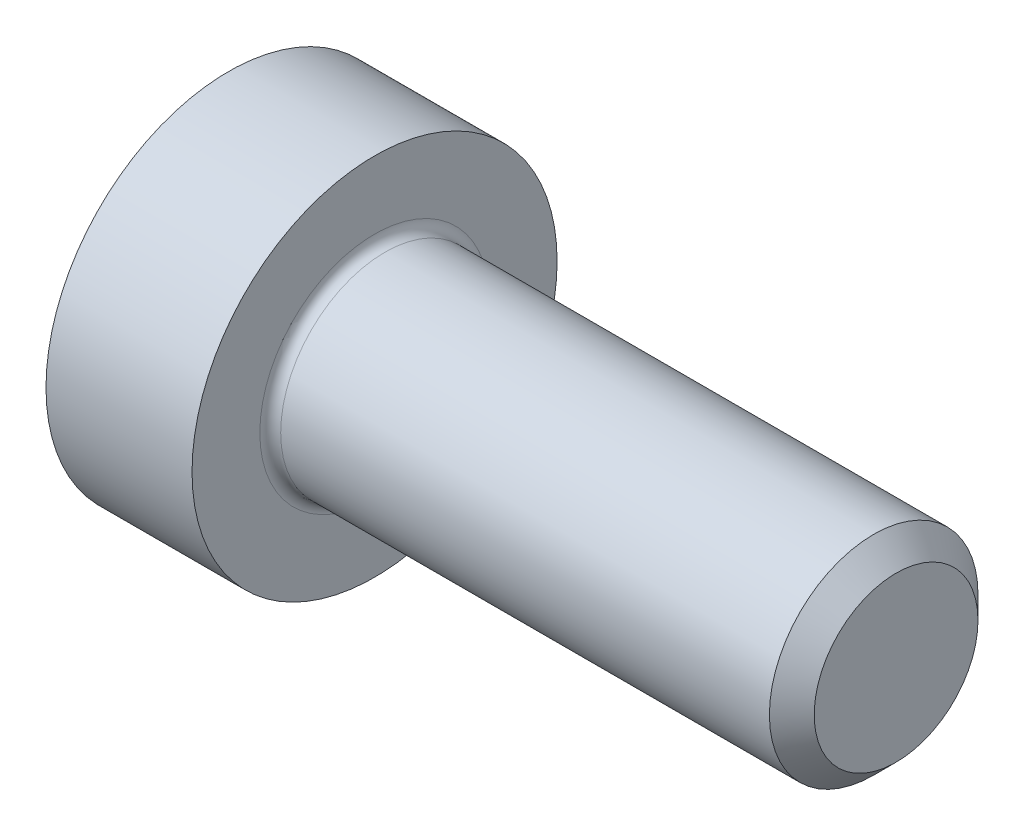
ISO-10303-21;
HEADER;
FILE_DESCRIPTION(('STEP AP214'),'2;1');
FILE_NAME('part.step','',(''),(''),'','','');
FILE_SCHEMA(('AUTOMOTIVE_DESIGN { 1 0 10303 214 1 1 1 1 }'));
ENDSEC;
DATA;
#1=APPLICATION_CONTEXT('core data for automotive mechanical design processes');
#2=APPLICATION_PROTOCOL_DEFINITION('international standard','automotive_design',2000,#1);
#3=PRODUCT_CONTEXT('',#1,'mechanical');
#4=PRODUCT('Part','Part','',(#3));
#5=PRODUCT_RELATED_PRODUCT_CATEGORY('part','',(#4));
#6=PRODUCT_DEFINITION_FORMATION('','',#4);
#7=PRODUCT_DEFINITION_CONTEXT('part definition',#1,'design');
#8=PRODUCT_DEFINITION('design','',#6,#7);
#9=PRODUCT_DEFINITION_SHAPE('','',#8);
#10=(LENGTH_UNIT() NAMED_UNIT(*) SI_UNIT(.MILLI.,.METRE.));
#11=(NAMED_UNIT(*) PLANE_ANGLE_UNIT() SI_UNIT($,.RADIAN.));
#12=(NAMED_UNIT(*) SI_UNIT($,.STERADIAN.) SOLID_ANGLE_UNIT());
#13=UNCERTAINTY_MEASURE_WITH_UNIT(LENGTH_MEASURE(1.E-05),#10,'distance_accuracy_value','');
#14=(GEOMETRIC_REPRESENTATION_CONTEXT(3) GLOBAL_UNCERTAINTY_ASSIGNED_CONTEXT((#13)) GLOBAL_UNIT_ASSIGNED_CONTEXT((#10,
#11,#12)) REPRESENTATION_CONTEXT('',''));
#15=CARTESIAN_POINT('',(0.,0.,0.));
#16=DIRECTION('',(0.,0.,1.));
#17=DIRECTION('',(1.,0.,0.));
#18=AXIS2_PLACEMENT_3D('',#15,#16,#17);
#19=CARTESIAN_POINT('',(-2.8,0.,0.));
#20=DIRECTION('',(1.,0.,0.));
#21=DIRECTION('',(0.,0.,-1.));
#22=AXIS2_PLACEMENT_3D('',#19,#20,#21);
#23=PLANE('',#22);
#24=CARTESIAN_POINT('',(-2.8,0.,0.));
#25=DIRECTION('',(1.,0.,0.));
#26=DIRECTION('',(0.,0.,-1.));
#27=AXIS2_PLACEMENT_3D('',#24,#25,#26);
#28=CIRCLE('',#27,3.5);
#29=CARTESIAN_POINT('',(-2.8,0.,-3.5));
#30=VERTEX_POINT('',#29);
#31=EDGE_CURVE('E139',#30,#30,#28,.T.);
#32=ORIENTED_EDGE('',*,*,#31,.F.);
#33=EDGE_LOOP('',(#32));
#34=FACE_BOUND('',#33,.T.);
#35=DIRECTION('',(0.,0.50000000000002,-0.866025403784427));
#36=VECTOR('',#35,1.);
#37=CARTESIAN_POINT('',(-2.8,-1.4433756729741,0.));
#38=LINE('',#37,#36);
#39=CARTESIAN_POINT('',(-2.8,-1.4433756729741,0.));
#40=VERTEX_POINT('',#39);
#41=CARTESIAN_POINT('',(-2.8,-0.72168783648703,-1.25));
#42=VERTEX_POINT('',#41);
#43=EDGE_CURVE('E122',#40,#42,#38,.T.);
#44=ORIENTED_EDGE('',*,*,#43,.T.);
#45=DIRECTION('',(0.,1.,0.));
#46=VECTOR('',#45,1.);
#47=CARTESIAN_POINT('',(-2.8,-0.72168783648703,-1.25));
#48=LINE('',#47,#46);
#49=CARTESIAN_POINT('',(-2.8,0.72168783648703,-1.25));
#50=VERTEX_POINT('',#49);
#51=EDGE_CURVE('E109',#42,#50,#48,.T.);
#52=ORIENTED_EDGE('',*,*,#51,.T.);
#53=DIRECTION('',(0.,0.50000000000002,0.866025403784427));
#54=VECTOR('',#53,1.);
#55=CARTESIAN_POINT('',(-2.8,0.72168783648703,-1.25));
#56=LINE('',#55,#54);
#57=CARTESIAN_POINT('',(-2.8,1.4433756729741,0.));
#58=VERTEX_POINT('',#57);
#59=EDGE_CURVE('E121',#50,#58,#56,.T.);
#60=ORIENTED_EDGE('',*,*,#59,.T.);
#61=DIRECTION('',(0.,-0.50000000000002,0.866025403784427));
#62=VECTOR('',#61,1.);
#63=CARTESIAN_POINT('',(-2.8,1.4433756729741,0.));
#64=LINE('',#63,#62);
#65=CARTESIAN_POINT('',(-2.8,0.72168783648703,1.25));
#66=VERTEX_POINT('',#65);
#67=EDGE_CURVE('E152',#58,#66,#64,.T.);
#68=ORIENTED_EDGE('',*,*,#67,.T.);
#69=DIRECTION('',(0.,-1.,0.));
#70=VECTOR('',#69,1.);
#71=CARTESIAN_POINT('',(-2.8,0.72168783648703,1.25));
#72=LINE('',#71,#70);
#73=CARTESIAN_POINT('',(-2.8,-0.72168783648703,1.25));
#74=VERTEX_POINT('',#73);
#75=EDGE_CURVE('E158',#66,#74,#72,.T.);
#76=ORIENTED_EDGE('',*,*,#75,.T.);
#77=DIRECTION('',(0.,-0.50000000000002,-0.866025403784427));
#78=VECTOR('',#77,1.);
#79=CARTESIAN_POINT('',(-2.8,-0.72168783648703,1.25));
#80=LINE('',#79,#78);
#81=EDGE_CURVE('E137',#74,#40,#80,.T.);
#82=ORIENTED_EDGE('',*,*,#81,.T.);
#83=EDGE_LOOP('',(#44,#52,#60,#68,#76,#82));
#84=FACE_BOUND('',#83,.T.);
#85=ADVANCED_FACE('F17',(#34,#84),#23,.F.);
#86=CARTESIAN_POINT('',(10.,0.,0.));
#87=DIRECTION('',(1.,0.,0.));
#88=DIRECTION('',(0.,0.,-1.));
#89=AXIS2_PLACEMENT_3D('',#86,#87,#88);
#90=CYLINDRICAL_SURFACE('',#89,3.5);
#91=CARTESIAN_POINT('',(0.,0.,0.));
#92=DIRECTION('',(1.,0.,0.));
#93=DIRECTION('',(0.,0.,-1.));
#94=AXIS2_PLACEMENT_3D('',#91,#92,#93);
#95=CIRCLE('',#94,3.5);
#96=CARTESIAN_POINT('',(0.,0.,-3.5));
#97=VERTEX_POINT('',#96);
#98=EDGE_CURVE('E167',#97,#97,#95,.T.);
#99=ORIENTED_EDGE('',*,*,#98,.F.);
#100=EDGE_LOOP('',(#99));
#101=FACE_BOUND('',#100,.T.);
#102=ORIENTED_EDGE('',*,*,#31,.T.);
#103=EDGE_LOOP('',(#102));
#104=FACE_BOUND('',#103,.T.);
#105=ADVANCED_FACE('F336',(#101,#104),#90,.T.);
#106=CARTESIAN_POINT('',(-0.5,-1.4433756729741,0.));
#107=DIRECTION('',(0.,0.866025403784427,0.50000000000002));
#108=DIRECTION('',(0.,-0.50000000000002,0.866025403784427));
#109=AXIS2_PLACEMENT_3D('',#106,#107,#108);
#110=PLANE('',#109);
#111=ORIENTED_EDGE('',*,*,#43,.F.);
#112=DIRECTION('',(-1.,0.,0.));
#113=VECTOR('',#112,1.);
#114=CARTESIAN_POINT('',(-0.5,-1.4433756729741,0.));
#115=LINE('',#114,#113);
#116=CARTESIAN_POINT('',(-0.5,-1.4433756729741,0.));
#117=VERTEX_POINT('',#116);
#118=EDGE_CURVE('E173',#117,#40,#115,.T.);
#119=ORIENTED_EDGE('',*,*,#118,.F.);
#120=DIRECTION('',(0.,0.50000000000002,-0.866025403784427));
#121=VECTOR('',#120,1.);
#122=CARTESIAN_POINT('',(-0.5,-1.4433756729741,0.));
#123=LINE('',#122,#121);
#124=CARTESIAN_POINT('',(-0.5,-1.08253175473053,-0.625000000000024));
#125=VERTEX_POINT('',#124);
#126=EDGE_CURVE('E176',#117,#125,#123,.T.);
#127=ORIENTED_EDGE('',*,*,#126,.T.);
#128=DIRECTION('',(0.,0.50000000000002,-0.866025403784427));
#129=VECTOR('',#128,1.);
#130=CARTESIAN_POINT('',(-0.5,-1.08253175473055,-0.625000000000031));
#131=LINE('',#130,#129);
#132=CARTESIAN_POINT('',(-0.5,-0.72168783648703,-1.25));
#133=VERTEX_POINT('',#132);
#134=EDGE_CURVE('E131',#125,#133,#131,.T.);
#135=ORIENTED_EDGE('',*,*,#134,.T.);
#136=DIRECTION('',(-1.,0.,0.));
#137=VECTOR('',#136,1.);
#138=CARTESIAN_POINT('',(-0.5,-0.72168783648703,-1.25));
#139=LINE('',#138,#137);
#140=EDGE_CURVE('E113',#133,#42,#139,.T.);
#141=ORIENTED_EDGE('',*,*,#140,.T.);
#142=EDGE_LOOP('',(#111,#119,#127,#135,#141));
#143=FACE_BOUND('',#142,.T.);
#144=ADVANCED_FACE('F127',(#143),#110,.T.);
#145=CARTESIAN_POINT('',(-0.5,-0.72168783648703,-1.25));
#146=DIRECTION('',(0.,0.,1.));
#147=DIRECTION('',(1.,0.,0.));
#148=AXIS2_PLACEMENT_3D('',#145,#146,#147);
#149=PLANE('',#148);
#150=ORIENTED_EDGE('',*,*,#51,.F.);
#151=ORIENTED_EDGE('',*,*,#140,.F.);
#152=DIRECTION('',(0.,1.,0.));
#153=VECTOR('',#152,1.);
#154=CARTESIAN_POINT('',(-0.5,-0.72168783648703,-1.25));
#155=LINE('',#154,#153);
#156=CARTESIAN_POINT('',(-0.5,0.,-1.25));
#157=VERTEX_POINT('',#156);
#158=EDGE_CURVE('E133',#133,#157,#155,.T.);
#159=ORIENTED_EDGE('',*,*,#158,.T.);
#160=DIRECTION('',(0.,1.,0.));
#161=VECTOR('',#160,1.);
#162=CARTESIAN_POINT('',(-0.5,0.,-1.25));
#163=LINE('',#162,#161);
#164=CARTESIAN_POINT('',(-0.5,0.72168783648703,-1.25));
#165=VERTEX_POINT('',#164);
#166=EDGE_CURVE('E191',#157,#165,#163,.T.);
#167=ORIENTED_EDGE('',*,*,#166,.T.);
#168=DIRECTION('',(-1.,0.,0.));
#169=VECTOR('',#168,1.);
#170=CARTESIAN_POINT('',(-0.5,0.72168783648703,-1.25));
#171=LINE('',#170,#169);
#172=EDGE_CURVE('E116',#165,#50,#171,.T.);
#173=ORIENTED_EDGE('',*,*,#172,.T.);
#174=EDGE_LOOP('',(#150,#151,#159,#167,#173));
#175=FACE_BOUND('',#174,.T.);
#176=ADVANCED_FACE('F111',(#175),#149,.T.);
#177=CARTESIAN_POINT('',(-0.5,0.72168783648703,-1.25));
#178=DIRECTION('',(0.,-0.866025403784427,0.50000000000002));
#179=DIRECTION('',(0.,-0.50000000000002,-0.866025403784427));
#180=AXIS2_PLACEMENT_3D('',#177,#178,#179);
#181=PLANE('',#180);
#182=ORIENTED_EDGE('',*,*,#59,.F.);
#183=ORIENTED_EDGE('',*,*,#172,.F.);
#184=DIRECTION('',(0.,0.50000000000002,0.866025403784427));
#185=VECTOR('',#184,1.);
#186=CARTESIAN_POINT('',(-0.5,0.72168783648703,-1.25));
#187=LINE('',#186,#185);
#188=CARTESIAN_POINT('',(-0.5,1.08253175473055,-0.625000000000032));
#189=VERTEX_POINT('',#188);
#190=EDGE_CURVE('E200',#165,#189,#187,.T.);
#191=ORIENTED_EDGE('',*,*,#190,.T.);
#192=DIRECTION('',(0.,0.50000000000002,0.866025403784427));
#193=VECTOR('',#192,1.);
#194=CARTESIAN_POINT('',(-0.5,1.08253175473055,-0.625000000000032));
#195=LINE('',#194,#193);
#196=CARTESIAN_POINT('',(-0.5,1.4433756729741,0.));
#197=VERTEX_POINT('',#196);
#198=EDGE_CURVE('E206',#189,#197,#195,.T.);
#199=ORIENTED_EDGE('',*,*,#198,.T.);
#200=DIRECTION('',(-1.,0.,0.));
#201=VECTOR('',#200,1.);
#202=CARTESIAN_POINT('',(-0.5,1.4433756729741,0.));
#203=LINE('',#202,#201);
#204=EDGE_CURVE('E212',#197,#58,#203,.T.);
#205=ORIENTED_EDGE('',*,*,#204,.T.);
#206=EDGE_LOOP('',(#182,#183,#191,#199,#205));
#207=FACE_BOUND('',#206,.T.);
#208=ADVANCED_FACE('F351',(#207),#181,.T.);
#209=CARTESIAN_POINT('',(-0.5,1.4433756729741,0.));
#210=DIRECTION('',(0.,-0.866025403784427,-0.50000000000002));
#211=DIRECTION('',(0.,0.50000000000002,-0.866025403784427));
#212=AXIS2_PLACEMENT_3D('',#209,#210,#211);
#213=PLANE('',#212);
#214=ORIENTED_EDGE('',*,*,#67,.F.);
#215=ORIENTED_EDGE('',*,*,#204,.F.);
#216=DIRECTION('',(0.,-0.50000000000002,0.866025403784427));
#217=VECTOR('',#216,1.);
#218=CARTESIAN_POINT('',(-0.5,1.4433756729741,0.));
#219=LINE('',#218,#217);
#220=CARTESIAN_POINT('',(-0.5,1.08253175473055,0.625000000000032));
#221=VERTEX_POINT('',#220);
#222=EDGE_CURVE('E218',#197,#221,#219,.T.);
#223=ORIENTED_EDGE('',*,*,#222,.T.);
#224=DIRECTION('',(0.,-0.50000000000002,0.866025403784427));
#225=VECTOR('',#224,1.);
#226=CARTESIAN_POINT('',(-0.5,1.08253175473055,0.625000000000032));
#227=LINE('',#226,#225);
#228=CARTESIAN_POINT('',(-0.5,0.72168783648703,1.25));
#229=VERTEX_POINT('',#228);
#230=EDGE_CURVE('E224',#221,#229,#227,.T.);
#231=ORIENTED_EDGE('',*,*,#230,.T.);
#232=DIRECTION('',(-1.,0.,0.));
#233=VECTOR('',#232,1.);
#234=CARTESIAN_POINT('',(-0.5,0.72168783648703,1.25));
#235=LINE('',#234,#233);
#236=EDGE_CURVE('E230',#229,#66,#235,.T.);
#237=ORIENTED_EDGE('',*,*,#236,.T.);
#238=EDGE_LOOP('',(#214,#215,#223,#231,#237));
#239=FACE_BOUND('',#238,.T.);
#240=ADVANCED_FACE('F354',(#239),#213,.T.);
#241=CARTESIAN_POINT('',(-0.5,0.72168783648703,1.25));
#242=DIRECTION('',(0.,0.,-1.));
#243=DIRECTION('',(-1.,0.,0.));
#244=AXIS2_PLACEMENT_3D('',#241,#242,#243);
#245=PLANE('',#244);
#246=ORIENTED_EDGE('',*,*,#75,.F.);
#247=ORIENTED_EDGE('',*,*,#236,.F.);
#248=DIRECTION('',(0.,-1.,0.));
#249=VECTOR('',#248,1.);
#250=CARTESIAN_POINT('',(-0.5,0.72168783648703,1.25));
#251=LINE('',#250,#249);
#252=CARTESIAN_POINT('',(-0.5,0.,1.25));
#253=VERTEX_POINT('',#252);
#254=EDGE_CURVE('E236',#229,#253,#251,.T.);
#255=ORIENTED_EDGE('',*,*,#254,.T.);
#256=DIRECTION('',(0.,-1.,0.));
#257=VECTOR('',#256,1.);
#258=CARTESIAN_POINT('',(-0.5,0.,1.25));
#259=LINE('',#258,#257);
#260=CARTESIAN_POINT('',(-0.5,-0.72168783648703,1.25));
#261=VERTEX_POINT('',#260);
#262=EDGE_CURVE('E242',#253,#261,#259,.T.);
#263=ORIENTED_EDGE('',*,*,#262,.T.);
#264=DIRECTION('',(-1.,0.,0.));
#265=VECTOR('',#264,1.);
#266=CARTESIAN_POINT('',(-0.5,-0.72168783648703,1.25));
#267=LINE('',#266,#265);
#268=EDGE_CURVE('E248',#261,#74,#267,.T.);
#269=ORIENTED_EDGE('',*,*,#268,.T.);
#270=EDGE_LOOP('',(#246,#247,#255,#263,#269));
#271=FACE_BOUND('',#270,.T.);
#272=ADVANCED_FACE('F358',(#271),#245,.T.);
#273=CARTESIAN_POINT('',(-0.5,-0.72168783648703,1.25));
#274=DIRECTION('',(0.,0.866025403784427,-0.50000000000002));
#275=DIRECTION('',(0.,0.50000000000002,0.866025403784427));
#276=AXIS2_PLACEMENT_3D('',#273,#274,#275);
#277=PLANE('',#276);
#278=ORIENTED_EDGE('',*,*,#81,.F.);
#279=ORIENTED_EDGE('',*,*,#268,.F.);
#280=DIRECTION('',(0.,-0.50000000000002,-0.866025403784427));
#281=VECTOR('',#280,1.);
#282=CARTESIAN_POINT('',(-0.5,-0.72168783648703,1.25));
#283=LINE('',#282,#281);
#284=CARTESIAN_POINT('',(-0.5,-1.08253175473055,0.625000000000032));
#285=VERTEX_POINT('',#284);
#286=EDGE_CURVE('E254',#261,#285,#283,.T.);
#287=ORIENTED_EDGE('',*,*,#286,.T.);
#288=DIRECTION('',(0.,-0.50000000000002,-0.866025403784427));
#289=VECTOR('',#288,1.);
#290=CARTESIAN_POINT('',(-0.5,-1.08253175473055,0.625000000000032));
#291=LINE('',#290,#289);
#292=EDGE_CURVE('E260',#285,#117,#291,.T.);
#293=ORIENTED_EDGE('',*,*,#292,.T.);
#294=ORIENTED_EDGE('',*,*,#118,.T.);
#295=EDGE_LOOP('',(#278,#279,#287,#293,#294));
#296=FACE_BOUND('',#295,.T.);
#297=ADVANCED_FACE('F332',(#296),#277,.T.);
#298=CARTESIAN_POINT('',(0.,3.5,0.));
#299=DIRECTION('',(-1.,0.,0.));
#300=DIRECTION('',(0.,0.,1.));
#301=AXIS2_PLACEMENT_3D('',#298,#299,#300);
#302=PLANE('',#301);
#303=CARTESIAN_POINT('',(0.,0.,0.));
#304=DIRECTION('',(1.,0.,0.));
#305=DIRECTION('',(0.,0.,-1.));
#306=AXIS2_PLACEMENT_3D('',#303,#304,#305);
#307=CIRCLE('',#306,2.2);
#308=CARTESIAN_POINT('',(0.,0.,-2.2));
#309=VERTEX_POINT('',#308);
#310=EDGE_CURVE('E266',#309,#309,#307,.T.);
#311=ORIENTED_EDGE('',*,*,#310,.F.);
#312=EDGE_LOOP('',(#311));
#313=FACE_BOUND('',#312,.T.);
#314=ORIENTED_EDGE('',*,*,#98,.T.);
#315=EDGE_LOOP('',(#314));
#316=FACE_BOUND('',#315,.T.);
#317=ADVANCED_FACE('F328',(#313,#316),#302,.F.);
#318=CARTESIAN_POINT('',(-0.5,0.,0.));
#319=DIRECTION('',(1.,0.,0.));
#320=DIRECTION('',(0.,0.,-1.));
#321=AXIS2_PLACEMENT_3D('',#318,#319,#320);
#322=PLANE('',#321);
#323=CARTESIAN_POINT('',(-0.5,0.,0.));
#324=DIRECTION('',(1.,0.,0.));
#325=DIRECTION('',(0.,-0.866025403784427,0.50000000000002));
#326=AXIS2_PLACEMENT_3D('',#323,#324,#325);
#327=CIRCLE('',#326,1.25);
#328=EDGE_CURVE('E43',#285,#125,#327,.T.);
#329=ORIENTED_EDGE('',*,*,#328,.T.);
#330=ORIENTED_EDGE('',*,*,#126,.F.);
#331=ORIENTED_EDGE('',*,*,#292,.F.);
#332=EDGE_LOOP('',(#329,#330,#331));
#333=FACE_BOUND('',#332,.T.);
#334=ADVANCED_FACE('F331',(#333),#322,.F.);
#335=CARTESIAN_POINT('',(-0.5,0.,0.));
#336=DIRECTION('',(1.,0.,0.));
#337=DIRECTION('',(0.,-0.866025403784427,-0.500000000000019));
#338=AXIS2_PLACEMENT_3D('',#335,#336,#337);
#339=CIRCLE('',#338,1.25);
#340=EDGE_CURVE('E274',#125,#157,#339,.T.);
#341=ORIENTED_EDGE('',*,*,#340,.T.);
#342=ORIENTED_EDGE('',*,*,#158,.F.);
#343=ORIENTED_EDGE('',*,*,#134,.F.);
#344=EDGE_LOOP('',(#341,#342,#343));
#345=FACE_BOUND('',#344,.T.);
#346=ADVANCED_FACE('F367',(#345),#322,.F.);
#347=CARTESIAN_POINT('',(-0.5,0.,0.));
#348=DIRECTION('',(1.,0.,0.));
#349=DIRECTION('',(0.,0.,-1.));
#350=AXIS2_PLACEMENT_3D('',#347,#348,#349);
#351=CIRCLE('',#350,1.25);
#352=EDGE_CURVE('E280',#157,#189,#351,.T.);
#353=ORIENTED_EDGE('',*,*,#352,.T.);
#354=ORIENTED_EDGE('',*,*,#190,.F.);
#355=ORIENTED_EDGE('',*,*,#166,.F.);
#356=EDGE_LOOP('',(#353,#354,#355));
#357=FACE_BOUND('',#356,.T.);
#358=ADVANCED_FACE('F433',(#357),#322,.F.);
#359=ORIENTED_EDGE('',*,*,#198,.F.);
#360=CARTESIAN_POINT('',(-0.5,0.,0.));
#361=DIRECTION('',(1.,0.,0.));
#362=DIRECTION('',(0.,0.866025403784427,-0.50000000000002));
#363=AXIS2_PLACEMENT_3D('',#360,#361,#362);
#364=CIRCLE('',#363,1.25);
#365=EDGE_CURVE('E286',#189,#221,#364,.T.);
#366=ORIENTED_EDGE('',*,*,#365,.T.);
#367=ORIENTED_EDGE('',*,*,#222,.F.);
#368=EDGE_LOOP('',(#359,#366,#367));
#369=FACE_BOUND('',#368,.T.);
#370=ADVANCED_FACE('F440',(#369),#322,.F.);
#371=CARTESIAN_POINT('',(-0.5,0.,0.));
#372=DIRECTION('',(1.,0.,0.));
#373=DIRECTION('',(0.,0.866025403784427,0.50000000000002));
#374=AXIS2_PLACEMENT_3D('',#371,#372,#373);
#375=CIRCLE('',#374,1.25);
#376=EDGE_CURVE('E292',#221,#253,#375,.T.);
#377=ORIENTED_EDGE('',*,*,#376,.T.);
#378=ORIENTED_EDGE('',*,*,#254,.F.);
#379=ORIENTED_EDGE('',*,*,#230,.F.);
#380=EDGE_LOOP('',(#377,#378,#379));
#381=FACE_BOUND('',#380,.T.);
#382=ADVANCED_FACE('F447',(#381),#322,.F.);
#383=CARTESIAN_POINT('',(-0.5,0.,0.));
#384=DIRECTION('',(1.,0.,0.));
#385=DIRECTION('',(0.,0.,1.));
#386=AXIS2_PLACEMENT_3D('',#383,#384,#385);
#387=CIRCLE('',#386,1.25);
#388=EDGE_CURVE('E298',#253,#285,#387,.T.);
#389=ORIENTED_EDGE('',*,*,#388,.T.);
#390=ORIENTED_EDGE('',*,*,#286,.F.);
#391=ORIENTED_EDGE('',*,*,#262,.F.);
#392=EDGE_LOOP('',(#389,#390,#391));
#393=FACE_BOUND('',#392,.T.);
#394=ADVANCED_FACE('F324',(#393),#322,.F.);
#395=CARTESIAN_POINT('',(0.200000000000016,0.,0.));
#396=DIRECTION('',(1.,0.,0.));
#397=DIRECTION('',(0.,0.,-1.));
#398=AXIS2_PLACEMENT_3D('',#395,#396,#397);
#399=TOROIDAL_SURFACE('',#398,2.2,0.200000000000016);
#400=CARTESIAN_POINT('',(0.199999999999999,0.,0.));
#401=DIRECTION('',(1.,0.,0.));
#402=DIRECTION('',(0.,0.,-1.));
#403=AXIS2_PLACEMENT_3D('',#400,#401,#402);
#404=CIRCLE('',#403,2.);
#405=CARTESIAN_POINT('',(0.199999999999999,0.,-2.));
#406=VERTEX_POINT('',#405);
#407=EDGE_CURVE('E303',#406,#406,#404,.T.);
#408=ORIENTED_EDGE('',*,*,#407,.F.);
#409=EDGE_LOOP('',(#408));
#410=FACE_BOUND('',#409,.T.);
#411=ORIENTED_EDGE('',*,*,#310,.T.);
#412=EDGE_LOOP('',(#411));
#413=FACE_BOUND('',#412,.T.);
#414=ADVANCED_FACE('F321',(#410,#413),#399,.F.);
#415=CARTESIAN_POINT('',(-0.5,0.,0.));
#416=DIRECTION('',(-1.,0.,0.));
#417=DIRECTION('',(0.,0.,1.));
#418=AXIS2_PLACEMENT_3D('',#415,#416,#417);
#419=CONICAL_SURFACE('',#418,1.25,1.22173047639603);
#420=CARTESIAN_POINT('',(-0.045037207167247,0.,0.));
#421=VERTEX_POINT('',#420);
#422=VERTEX_LOOP('',#421);
#423=FACE_BOUND('',#422,.T.);
#424=ORIENTED_EDGE('',*,*,#365,.F.);
#425=ORIENTED_EDGE('',*,*,#352,.F.);
#426=ORIENTED_EDGE('',*,*,#340,.F.);
#427=ORIENTED_EDGE('',*,*,#328,.F.);
#428=ORIENTED_EDGE('',*,*,#388,.F.);
#429=ORIENTED_EDGE('',*,*,#376,.F.);
#430=EDGE_LOOP('',(#424,#425,#426,#427,#428,#429));
#431=FACE_BOUND('',#430,.T.);
#432=ADVANCED_FACE('F317',(#423,#431),#419,.F.);
#433=CARTESIAN_POINT('',(10.,0.,0.));
#434=DIRECTION('',(1.,0.,0.));
#435=DIRECTION('',(0.,0.,-1.));
#436=AXIS2_PLACEMENT_3D('',#433,#434,#435);
#437=CYLINDRICAL_SURFACE('',#436,2.);
#438=CARTESIAN_POINT('',(9.5705,0.,0.));
#439=DIRECTION('',(1.,0.,0.));
#440=DIRECTION('',(0.,0.,-1.));
#441=AXIS2_PLACEMENT_3D('',#438,#439,#440);
#442=CIRCLE('',#441,2.);
#443=CARTESIAN_POINT('',(9.5705,0.,-2.));
#444=VERTEX_POINT('',#443);
#445=EDGE_CURVE('E26',#444,#444,#442,.T.);
#446=ORIENTED_EDGE('',*,*,#445,.F.);
#447=EDGE_LOOP('',(#446));
#448=FACE_BOUND('',#447,.T.);
#449=ORIENTED_EDGE('',*,*,#407,.T.);
#450=EDGE_LOOP('',(#449));
#451=FACE_BOUND('',#450,.T.);
#452=ADVANCED_FACE('F314',(#448,#451),#437,.T.);
#453=CARTESIAN_POINT('',(9.5705,0.,0.));
#454=DIRECTION('',(-1.,0.,0.));
#455=DIRECTION('',(0.,0.,1.));
#456=AXIS2_PLACEMENT_3D('',#453,#454,#455);
#457=CONICAL_SURFACE('',#456,2.,0.785398163397448);
#458=CARTESIAN_POINT('',(10.,0.,0.));
#459=DIRECTION('',(1.,0.,0.));
#460=DIRECTION('',(0.,0.,-1.));
#461=AXIS2_PLACEMENT_3D('',#458,#459,#460);
#462=CIRCLE('',#461,1.5705);
#463=CARTESIAN_POINT('',(10.,0.,-1.5705));
#464=VERTEX_POINT('',#463);
#465=EDGE_CURVE('E11',#464,#464,#462,.T.);
#466=ORIENTED_EDGE('',*,*,#465,.F.);
#467=EDGE_LOOP('',(#466));
#468=FACE_BOUND('',#467,.T.);
#469=ORIENTED_EDGE('',*,*,#445,.T.);
#470=EDGE_LOOP('',(#469));
#471=FACE_BOUND('',#470,.T.);
#472=ADVANCED_FACE('F312',(#468,#471),#457,.T.);
#473=CARTESIAN_POINT('',(10.,1.5705,0.));
#474=DIRECTION('',(-1.,0.,0.));
#475=DIRECTION('',(0.,0.,1.));
#476=AXIS2_PLACEMENT_3D('',#473,#474,#475);
#477=PLANE('',#476);
#478=ORIENTED_EDGE('',*,*,#465,.T.);
#479=EDGE_LOOP('',(#478));
#480=FACE_BOUND('',#479,.T.);
#481=ADVANCED_FACE('F19',(#480),#477,.F.);
#482=CLOSED_SHELL('',(#85,#105,#144,#176,#208,#240,#272,#297,#317,#334,#346,#358,#370,#382,#394,
#414,#432,#452,#472,#481));
#483=MANIFOLD_SOLID_BREP('B1',#482);
#484=ADVANCED_BREP_SHAPE_REPRESENTATION('',(#18,#483),#14);
#485=SHAPE_DEFINITION_REPRESENTATION(#9,#484);
ENDSEC;
END-ISO-10303-21;
